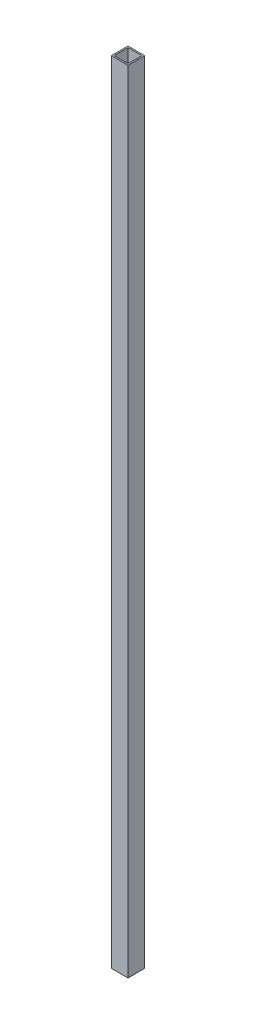
ISO-10303-21;
HEADER;
FILE_DESCRIPTION(('STEP AP214'),'2;1');
FILE_NAME('part.step','',(''),(''),'','','');
FILE_SCHEMA(('AUTOMOTIVE_DESIGN { 1 0 10303 214 1 1 1 1 }'));
ENDSEC;
DATA;
#1=APPLICATION_CONTEXT('core data for automotive mechanical design processes');
#2=APPLICATION_PROTOCOL_DEFINITION('international standard','automotive_design',2000,#1);
#3=PRODUCT_CONTEXT('',#1,'mechanical');
#4=PRODUCT('Part','Part','',(#3));
#5=PRODUCT_RELATED_PRODUCT_CATEGORY('part','',(#4));
#6=PRODUCT_DEFINITION_FORMATION('','',#4);
#7=PRODUCT_DEFINITION_CONTEXT('part definition',#1,'design');
#8=PRODUCT_DEFINITION('design','',#6,#7);
#9=PRODUCT_DEFINITION_SHAPE('','',#8);
#10=(LENGTH_UNIT() NAMED_UNIT(*) SI_UNIT(.MILLI.,.METRE.));
#11=(NAMED_UNIT(*) PLANE_ANGLE_UNIT() SI_UNIT($,.RADIAN.));
#12=(NAMED_UNIT(*) SI_UNIT($,.STERADIAN.) SOLID_ANGLE_UNIT());
#13=UNCERTAINTY_MEASURE_WITH_UNIT(LENGTH_MEASURE(1.E-05),#10,'distance_accuracy_value','');
#14=(GEOMETRIC_REPRESENTATION_CONTEXT(3) GLOBAL_UNCERTAINTY_ASSIGNED_CONTEXT((#13)) GLOBAL_UNIT_ASSIGNED_CONTEXT((#10,
#11,#12)) REPRESENTATION_CONTEXT('',''));
#15=CARTESIAN_POINT('',(0.,0.,0.));
#16=DIRECTION('',(0.,0.,1.));
#17=DIRECTION('',(1.,0.,0.));
#18=AXIS2_PLACEMENT_3D('',#15,#16,#17);
#19=CARTESIAN_POINT('',(0.,901.7,0.));
#20=DIRECTION('',(0.,-1.,0.));
#21=DIRECTION('',(0.,0.,-1.));
#22=AXIS2_PLACEMENT_3D('',#19,#20,#21);
#23=PLANE('',#22);
#24=DIRECTION('',(0.,0.,1.));
#25=VECTOR('',#24,1.);
#26=CARTESIAN_POINT('',(0.,901.7,0.));
#27=LINE('',#26,#25);
#28=CARTESIAN_POINT('',(0.,901.7,-19.05));
#29=VERTEX_POINT('',#28);
#30=CARTESIAN_POINT('',(0.,901.7,0.));
#31=VERTEX_POINT('',#30);
#32=EDGE_CURVE('E169',#29,#31,#27,.T.);
#33=ORIENTED_EDGE('',*,*,#32,.T.);
#34=DIRECTION('',(1.,0.,0.));
#35=VECTOR('',#34,1.);
#36=CARTESIAN_POINT('',(0.,901.7,0.));
#37=LINE('',#36,#35);
#38=CARTESIAN_POINT('',(19.05,901.7,0.));
#39=VERTEX_POINT('',#38);
#40=EDGE_CURVE('E173',#31,#39,#37,.T.);
#41=ORIENTED_EDGE('',*,*,#40,.T.);
#42=DIRECTION('',(0.,0.,-1.));
#43=VECTOR('',#42,1.);
#44=CARTESIAN_POINT('',(19.05,901.7,0.));
#45=LINE('',#44,#43);
#46=CARTESIAN_POINT('',(19.05,901.7,-19.05));
#47=VERTEX_POINT('',#46);
#48=EDGE_CURVE('E177',#39,#47,#45,.T.);
#49=ORIENTED_EDGE('',*,*,#48,.T.);
#50=DIRECTION('',(-1.,0.,0.));
#51=VECTOR('',#50,1.);
#52=CARTESIAN_POINT('',(0.,901.7,-19.05));
#53=LINE('',#52,#51);
#54=EDGE_CURVE('E180',#47,#29,#53,.T.);
#55=ORIENTED_EDGE('',*,*,#54,.T.);
#56=EDGE_LOOP('',(#33,#41,#49,#55));
#57=FACE_BOUND('',#56,.T.);
#58=DIRECTION('',(0.,0.,-1.));
#59=VECTOR('',#58,1.);
#60=CARTESIAN_POINT('',(17.4625,901.7,-1.5875));
#61=LINE('',#60,#59);
#62=CARTESIAN_POINT('',(17.4625,901.7,-1.5875));
#63=VERTEX_POINT('',#62);
#64=CARTESIAN_POINT('',(17.4625,901.7,-17.4625));
#65=VERTEX_POINT('',#64);
#66=EDGE_CURVE('E121',#63,#65,#61,.T.);
#67=ORIENTED_EDGE('',*,*,#66,.F.);
#68=DIRECTION('',(1.,0.,0.));
#69=VECTOR('',#68,1.);
#70=CARTESIAN_POINT('',(1.5875,901.7,-1.5875));
#71=LINE('',#70,#69);
#72=CARTESIAN_POINT('',(1.5875,901.7,-1.5875));
#73=VERTEX_POINT('',#72);
#74=EDGE_CURVE('E147',#73,#63,#71,.T.);
#75=ORIENTED_EDGE('',*,*,#74,.F.);
#76=DIRECTION('',(0.,0.,1.));
#77=VECTOR('',#76,1.);
#78=CARTESIAN_POINT('',(1.5875,901.7,-1.5875));
#79=LINE('',#78,#77);
#80=CARTESIAN_POINT('',(1.5875,901.7,-17.4625));
#81=VERTEX_POINT('',#80);
#82=EDGE_CURVE('E143',#81,#73,#79,.T.);
#83=ORIENTED_EDGE('',*,*,#82,.F.);
#84=DIRECTION('',(-1.,0.,0.));
#85=VECTOR('',#84,1.);
#86=CARTESIAN_POINT('',(1.5875,901.7,-17.4625));
#87=LINE('',#86,#85);
#88=EDGE_CURVE('E130',#65,#81,#87,.T.);
#89=ORIENTED_EDGE('',*,*,#88,.F.);
#90=EDGE_LOOP('',(#67,#75,#83,#89));
#91=FACE_BOUND('',#90,.T.);
#92=ADVANCED_FACE('F39',(#57,#91),#23,.F.);
#93=CARTESIAN_POINT('',(0.,0.,0.));
#94=DIRECTION('',(0.,-1.,0.));
#95=DIRECTION('',(0.,0.,-1.));
#96=AXIS2_PLACEMENT_3D('',#93,#94,#95);
#97=PLANE('',#96);
#98=DIRECTION('',(0.,0.,1.));
#99=VECTOR('',#98,1.);
#100=CARTESIAN_POINT('',(0.,0.,0.));
#101=LINE('',#100,#99);
#102=CARTESIAN_POINT('',(0.,0.,-19.05));
#103=VERTEX_POINT('',#102);
#104=CARTESIAN_POINT('',(0.,0.,0.));
#105=VERTEX_POINT('',#104);
#106=EDGE_CURVE('E139',#103,#105,#101,.T.);
#107=ORIENTED_EDGE('',*,*,#106,.F.);
#108=DIRECTION('',(-1.,0.,0.));
#109=VECTOR('',#108,1.);
#110=CARTESIAN_POINT('',(0.,0.,-19.05));
#111=LINE('',#110,#109);
#112=CARTESIAN_POINT('',(19.05,0.,-19.05));
#113=VERTEX_POINT('',#112);
#114=EDGE_CURVE('E174',#113,#103,#111,.T.);
#115=ORIENTED_EDGE('',*,*,#114,.F.);
#116=DIRECTION('',(0.,0.,-1.));
#117=VECTOR('',#116,1.);
#118=CARTESIAN_POINT('',(19.05,0.,0.));
#119=LINE('',#118,#117);
#120=CARTESIAN_POINT('',(19.05,0.,0.));
#121=VERTEX_POINT('',#120);
#122=EDGE_CURVE('E190',#121,#113,#119,.T.);
#123=ORIENTED_EDGE('',*,*,#122,.F.);
#124=DIRECTION('',(1.,0.,0.));
#125=VECTOR('',#124,1.);
#126=CARTESIAN_POINT('',(0.,0.,0.));
#127=LINE('',#126,#125);
#128=EDGE_CURVE('E187',#105,#121,#127,.T.);
#129=ORIENTED_EDGE('',*,*,#128,.F.);
#130=EDGE_LOOP('',(#107,#115,#123,#129));
#131=FACE_BOUND('',#130,.T.);
#132=DIRECTION('',(1.,0.,0.));
#133=VECTOR('',#132,1.);
#134=CARTESIAN_POINT('',(1.5875,0.,-1.5875));
#135=LINE('',#134,#133);
#136=CARTESIAN_POINT('',(1.5875,0.,-1.5875));
#137=VERTEX_POINT('',#136);
#138=CARTESIAN_POINT('',(17.4625,0.,-1.5875));
#139=VERTEX_POINT('',#138);
#140=EDGE_CURVE('E131',#137,#139,#135,.T.);
#141=ORIENTED_EDGE('',*,*,#140,.T.);
#142=DIRECTION('',(0.,0.,-1.));
#143=VECTOR('',#142,1.);
#144=CARTESIAN_POINT('',(17.4625,0.,-1.5875));
#145=LINE('',#144,#143);
#146=CARTESIAN_POINT('',(17.4625,0.,-17.4625));
#147=VERTEX_POINT('',#146);
#148=EDGE_CURVE('E69',#139,#147,#145,.T.);
#149=ORIENTED_EDGE('',*,*,#148,.T.);
#150=DIRECTION('',(-1.,0.,0.));
#151=VECTOR('',#150,1.);
#152=CARTESIAN_POINT('',(1.5875,0.,-17.4625));
#153=LINE('',#152,#151);
#154=CARTESIAN_POINT('',(1.5875,0.,-17.4625));
#155=VERTEX_POINT('',#154);
#156=EDGE_CURVE('E137',#147,#155,#153,.T.);
#157=ORIENTED_EDGE('',*,*,#156,.T.);
#158=DIRECTION('',(0.,0.,1.));
#159=VECTOR('',#158,1.);
#160=CARTESIAN_POINT('',(1.5875,0.,-1.5875));
#161=LINE('',#160,#159);
#162=EDGE_CURVE('E156',#155,#137,#161,.T.);
#163=ORIENTED_EDGE('',*,*,#162,.T.);
#164=EDGE_LOOP('',(#141,#149,#157,#163));
#165=FACE_BOUND('',#164,.T.);
#166=ADVANCED_FACE('F213',(#131,#165),#97,.T.);
#167=CARTESIAN_POINT('',(0.,901.7,0.));
#168=DIRECTION('',(1.,0.,0.));
#169=DIRECTION('',(0.,0.,-1.));
#170=AXIS2_PLACEMENT_3D('',#167,#168,#169);
#171=PLANE('',#170);
#172=ORIENTED_EDGE('',*,*,#106,.T.);
#173=DIRECTION('',(0.,-1.,0.));
#174=VECTOR('',#173,1.);
#175=CARTESIAN_POINT('',(0.,901.7,0.));
#176=LINE('',#175,#174);
#177=EDGE_CURVE('E11',#31,#105,#176,.T.);
#178=ORIENTED_EDGE('',*,*,#177,.F.);
#179=ORIENTED_EDGE('',*,*,#32,.F.);
#180=DIRECTION('',(0.,-1.,0.));
#181=VECTOR('',#180,1.);
#182=CARTESIAN_POINT('',(0.,901.7,-19.05));
#183=LINE('',#182,#181);
#184=EDGE_CURVE('E183',#29,#103,#183,.T.);
#185=ORIENTED_EDGE('',*,*,#184,.T.);
#186=EDGE_LOOP('',(#172,#178,#179,#185));
#187=FACE_BOUND('',#186,.T.);
#188=ADVANCED_FACE('F41',(#187),#171,.F.);
#189=CARTESIAN_POINT('',(0.,901.7,0.));
#190=DIRECTION('',(0.,0.,-1.));
#191=DIRECTION('',(-1.,0.,0.));
#192=AXIS2_PLACEMENT_3D('',#189,#190,#191);
#193=PLANE('',#192);
#194=ORIENTED_EDGE('',*,*,#128,.T.);
#195=DIRECTION('',(0.,-1.,0.));
#196=VECTOR('',#195,1.);
#197=CARTESIAN_POINT('',(19.05,901.7,0.));
#198=LINE('',#197,#196);
#199=EDGE_CURVE('E48',#39,#121,#198,.T.);
#200=ORIENTED_EDGE('',*,*,#199,.F.);
#201=ORIENTED_EDGE('',*,*,#40,.F.);
#202=ORIENTED_EDGE('',*,*,#177,.T.);
#203=EDGE_LOOP('',(#194,#200,#201,#202));
#204=FACE_BOUND('',#203,.T.);
#205=ADVANCED_FACE('F223',(#204),#193,.F.);
#206=CARTESIAN_POINT('',(19.05,901.7,0.));
#207=DIRECTION('',(-1.,0.,0.));
#208=DIRECTION('',(0.,0.,1.));
#209=AXIS2_PLACEMENT_3D('',#206,#207,#208);
#210=PLANE('',#209);
#211=ORIENTED_EDGE('',*,*,#122,.T.);
#212=DIRECTION('',(0.,-1.,0.));
#213=VECTOR('',#212,1.);
#214=CARTESIAN_POINT('',(19.05,901.7,-19.05));
#215=LINE('',#214,#213);
#216=EDGE_CURVE('E198',#47,#113,#215,.T.);
#217=ORIENTED_EDGE('',*,*,#216,.F.);
#218=ORIENTED_EDGE('',*,*,#48,.F.);
#219=ORIENTED_EDGE('',*,*,#199,.T.);
#220=EDGE_LOOP('',(#211,#217,#218,#219));
#221=FACE_BOUND('',#220,.T.);
#222=ADVANCED_FACE('F207',(#221),#210,.F.);
#223=CARTESIAN_POINT('',(0.,901.7,-19.05));
#224=DIRECTION('',(0.,0.,1.));
#225=DIRECTION('',(1.,0.,0.));
#226=AXIS2_PLACEMENT_3D('',#223,#224,#225);
#227=PLANE('',#226);
#228=ORIENTED_EDGE('',*,*,#114,.T.);
#229=ORIENTED_EDGE('',*,*,#184,.F.);
#230=ORIENTED_EDGE('',*,*,#54,.F.);
#231=ORIENTED_EDGE('',*,*,#216,.T.);
#232=EDGE_LOOP('',(#228,#229,#230,#231));
#233=FACE_BOUND('',#232,.T.);
#234=ADVANCED_FACE('F217',(#233),#227,.F.);
#235=CARTESIAN_POINT('',(17.4625,901.7,-1.5875));
#236=DIRECTION('',(-1.,0.,0.));
#237=DIRECTION('',(0.,0.,1.));
#238=AXIS2_PLACEMENT_3D('',#235,#236,#237);
#239=PLANE('',#238);
#240=ORIENTED_EDGE('',*,*,#148,.F.);
#241=DIRECTION('',(0.,-1.,0.));
#242=VECTOR('',#241,1.);
#243=CARTESIAN_POINT('',(17.4625,901.7,-1.5875));
#244=LINE('',#243,#242);
#245=EDGE_CURVE('E125',#63,#139,#244,.T.);
#246=ORIENTED_EDGE('',*,*,#245,.F.);
#247=ORIENTED_EDGE('',*,*,#66,.T.);
#248=DIRECTION('',(0.,-1.,0.));
#249=VECTOR('',#248,1.);
#250=CARTESIAN_POINT('',(17.4625,901.7,-17.4625));
#251=LINE('',#250,#249);
#252=EDGE_CURVE('E124',#65,#147,#251,.T.);
#253=ORIENTED_EDGE('',*,*,#252,.T.);
#254=EDGE_LOOP('',(#240,#246,#247,#253));
#255=FACE_BOUND('',#254,.T.);
#256=ADVANCED_FACE('F123',(#255),#239,.T.);
#257=CARTESIAN_POINT('',(1.5875,901.7,-17.4625));
#258=DIRECTION('',(0.,0.,1.));
#259=DIRECTION('',(1.,0.,0.));
#260=AXIS2_PLACEMENT_3D('',#257,#258,#259);
#261=PLANE('',#260);
#262=ORIENTED_EDGE('',*,*,#156,.F.);
#263=ORIENTED_EDGE('',*,*,#252,.F.);
#264=ORIENTED_EDGE('',*,*,#88,.T.);
#265=DIRECTION('',(0.,-1.,0.));
#266=VECTOR('',#265,1.);
#267=CARTESIAN_POINT('',(1.5875,901.7,-17.4625));
#268=LINE('',#267,#266);
#269=EDGE_CURVE('E140',#81,#155,#268,.T.);
#270=ORIENTED_EDGE('',*,*,#269,.T.);
#271=EDGE_LOOP('',(#262,#263,#264,#270));
#272=FACE_BOUND('',#271,.T.);
#273=ADVANCED_FACE('F134',(#272),#261,.T.);
#274=CARTESIAN_POINT('',(1.5875,901.7,-1.5875));
#275=DIRECTION('',(1.,0.,0.));
#276=DIRECTION('',(0.,0.,-1.));
#277=AXIS2_PLACEMENT_3D('',#274,#275,#276);
#278=PLANE('',#277);
#279=ORIENTED_EDGE('',*,*,#162,.F.);
#280=ORIENTED_EDGE('',*,*,#269,.F.);
#281=ORIENTED_EDGE('',*,*,#82,.T.);
#282=DIRECTION('',(0.,-1.,0.));
#283=VECTOR('',#282,1.);
#284=CARTESIAN_POINT('',(1.5875,901.7,-1.5875));
#285=LINE('',#284,#283);
#286=EDGE_CURVE('E58',#73,#137,#285,.T.);
#287=ORIENTED_EDGE('',*,*,#286,.T.);
#288=EDGE_LOOP('',(#279,#280,#281,#287));
#289=FACE_BOUND('',#288,.T.);
#290=ADVANCED_FACE('F246',(#289),#278,.T.);
#291=CARTESIAN_POINT('',(1.5875,901.7,-1.5875));
#292=DIRECTION('',(0.,0.,-1.));
#293=DIRECTION('',(-1.,0.,0.));
#294=AXIS2_PLACEMENT_3D('',#291,#292,#293);
#295=PLANE('',#294);
#296=ORIENTED_EDGE('',*,*,#140,.F.);
#297=ORIENTED_EDGE('',*,*,#286,.F.);
#298=ORIENTED_EDGE('',*,*,#74,.T.);
#299=ORIENTED_EDGE('',*,*,#245,.T.);
#300=EDGE_LOOP('',(#296,#297,#298,#299));
#301=FACE_BOUND('',#300,.T.);
#302=ADVANCED_FACE('F250',(#301),#295,.T.);
#303=CLOSED_SHELL('',(#92,#166,#188,#205,#222,#234,#256,#273,#290,#302));
#304=MANIFOLD_SOLID_BREP('B2',#303);
#305=ADVANCED_BREP_SHAPE_REPRESENTATION('',(#18,#304),#14);
#306=SHAPE_DEFINITION_REPRESENTATION(#9,#305);
ENDSEC;
END-ISO-10303-21;
